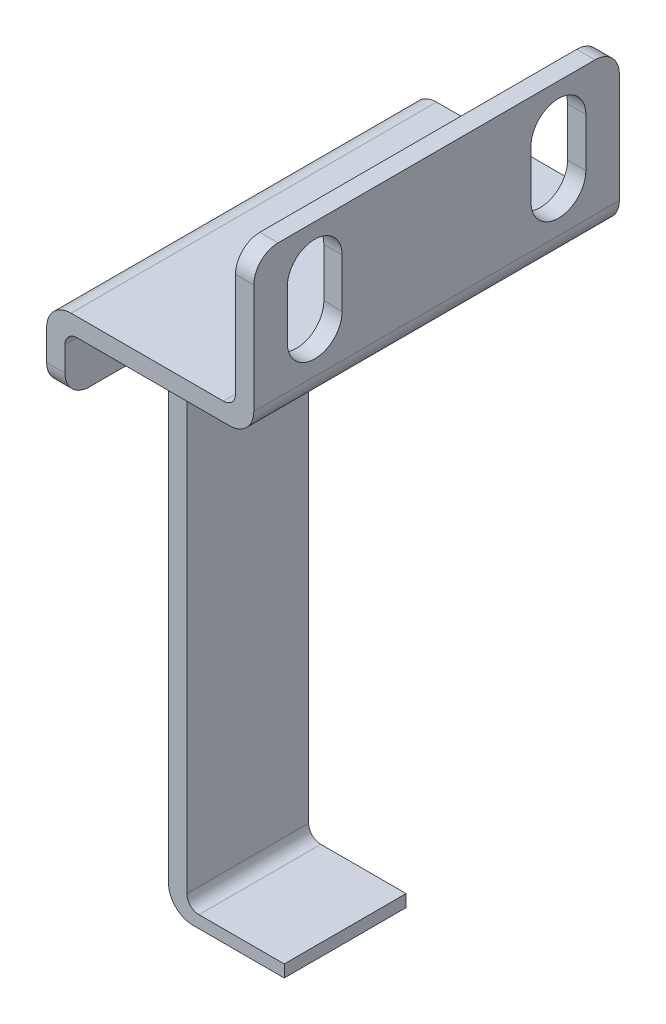
ISO-10303-21;
HEADER;
FILE_DESCRIPTION(('STEP AP214'),'2;1');
FILE_NAME('part.step','',(''),(''),'','','');
FILE_SCHEMA(('AUTOMOTIVE_DESIGN { 1 0 10303 214 1 1 1 1 }'));
ENDSEC;
DATA;
#1=APPLICATION_CONTEXT('core data for automotive mechanical design processes');
#2=APPLICATION_PROTOCOL_DEFINITION('international standard','automotive_design',2000,#1);
#3=PRODUCT_CONTEXT('',#1,'mechanical');
#4=PRODUCT('Part','Part','',(#3));
#5=PRODUCT_RELATED_PRODUCT_CATEGORY('part','',(#4));
#6=PRODUCT_DEFINITION_FORMATION('','',#4);
#7=PRODUCT_DEFINITION_CONTEXT('part definition',#1,'design');
#8=PRODUCT_DEFINITION('design','',#6,#7);
#9=PRODUCT_DEFINITION_SHAPE('','',#8);
#10=(LENGTH_UNIT() NAMED_UNIT(*) SI_UNIT(.MILLI.,.METRE.));
#11=(NAMED_UNIT(*) PLANE_ANGLE_UNIT() SI_UNIT($,.RADIAN.));
#12=(NAMED_UNIT(*) SI_UNIT($,.STERADIAN.) SOLID_ANGLE_UNIT());
#13=UNCERTAINTY_MEASURE_WITH_UNIT(LENGTH_MEASURE(1.E-05),#10,'distance_accuracy_value','');
#14=(GEOMETRIC_REPRESENTATION_CONTEXT(3) GLOBAL_UNCERTAINTY_ASSIGNED_CONTEXT((#13)) GLOBAL_UNIT_ASSIGNED_CONTEXT((#10,
#11,#12)) REPRESENTATION_CONTEXT('',''));
#15=CARTESIAN_POINT('',(0.,0.,0.));
#16=DIRECTION('',(0.,0.,1.));
#17=DIRECTION('',(1.,0.,0.));
#18=AXIS2_PLACEMENT_3D('',#15,#16,#17);
#19=CARTESIAN_POINT('',(-15.5,-37.,30.));
#20=DIRECTION('',(-1.,0.,0.));
#21=DIRECTION('',(0.,-1.,0.));
#22=AXIS2_PLACEMENT_3D('',#19,#20,#21);
#23=PLANE('',#22);
#24=DIRECTION('',(0.,1.,0.));
#25=VECTOR('',#24,1.);
#26=CARTESIAN_POINT('',(-15.5,-37.,0.));
#27=LINE('',#26,#25);
#28=CARTESIAN_POINT('',(-15.5,-3.,0.));
#29=VERTEX_POINT('',#28);
#30=CARTESIAN_POINT('',(-15.5,-1.,0.));
#31=VERTEX_POINT('',#30);
#32=EDGE_CURVE('E376',#29,#31,#27,.T.);
#33=ORIENTED_EDGE('',*,*,#32,.T.);
#34=DIRECTION('',(0.,0.,-1.));
#35=VECTOR('',#34,1.);
#36=CARTESIAN_POINT('',(-15.5,-1.,30.));
#37=LINE('',#36,#35);
#38=CARTESIAN_POINT('',(-15.5,-1.,30.));
#39=VERTEX_POINT('',#38);
#40=EDGE_CURVE('E432',#31,#39,#37,.F.);
#41=ORIENTED_EDGE('',*,*,#40,.T.);
#42=DIRECTION('',(0.,1.,0.));
#43=VECTOR('',#42,1.);
#44=CARTESIAN_POINT('',(-15.5,-37.,30.));
#45=LINE('',#44,#43);
#46=CARTESIAN_POINT('',(-15.5,-3.,30.));
#47=VERTEX_POINT('',#46);
#48=EDGE_CURVE('E374',#47,#39,#45,.T.);
#49=ORIENTED_EDGE('',*,*,#48,.F.);
#50=CARTESIAN_POINT('',(-15.5,-3.,28.));
#51=DIRECTION('',(-1.,0.,0.));
#52=DIRECTION('',(0.,-1.,0.));
#53=AXIS2_PLACEMENT_3D('',#50,#51,#52);
#54=CIRCLE('',#53,2.);
#55=CARTESIAN_POINT('',(-15.5,-5.,28.));
#56=VERTEX_POINT('',#55);
#57=EDGE_CURVE('E388',#47,#56,#54,.F.);
#58=ORIENTED_EDGE('',*,*,#57,.T.);
#59=DIRECTION('',(0.,0.,-1.));
#60=VECTOR('',#59,1.);
#61=CARTESIAN_POINT('',(-15.5,-5.,30.));
#62=LINE('',#61,#60);
#63=CARTESIAN_POINT('',(-15.5,-5.,20.));
#64=VERTEX_POINT('',#63);
#65=EDGE_CURVE('E238',#56,#64,#62,.T.);
#66=ORIENTED_EDGE('',*,*,#65,.T.);
#67=DIRECTION('',(0.,-1.,0.));
#68=VECTOR('',#67,1.);
#69=CARTESIAN_POINT('',(-15.5,-37.,20.));
#70=LINE('',#69,#68);
#71=CARTESIAN_POINT('',(-15.5,-45.,20.));
#72=VERTEX_POINT('',#71);
#73=EDGE_CURVE('E335',#64,#72,#70,.T.);
#74=ORIENTED_EDGE('',*,*,#73,.T.);
#75=DIRECTION('',(0.,0.,1.));
#76=VECTOR('',#75,1.);
#77=CARTESIAN_POINT('',(-15.5,-45.,10.));
#78=LINE('',#77,#76);
#79=CARTESIAN_POINT('',(-15.5,-45.,10.));
#80=VERTEX_POINT('',#79);
#81=EDGE_CURVE('E430',#72,#80,#78,.F.);
#82=ORIENTED_EDGE('',*,*,#81,.T.);
#83=DIRECTION('',(0.,1.,0.));
#84=VECTOR('',#83,1.);
#85=CARTESIAN_POINT('',(-15.5,-37.,10.));
#86=LINE('',#85,#84);
#87=CARTESIAN_POINT('',(-15.5,-5.,10.));
#88=VERTEX_POINT('',#87);
#89=EDGE_CURVE('E339',#80,#88,#86,.T.);
#90=ORIENTED_EDGE('',*,*,#89,.T.);
#91=DIRECTION('',(0.,0.,-1.));
#92=VECTOR('',#91,1.);
#93=CARTESIAN_POINT('',(-15.5,-5.,30.));
#94=LINE('',#93,#92);
#95=CARTESIAN_POINT('',(-15.5,-5.,2.));
#96=VERTEX_POINT('',#95);
#97=EDGE_CURVE('E367',#88,#96,#94,.T.);
#98=ORIENTED_EDGE('',*,*,#97,.T.);
#99=CARTESIAN_POINT('',(-15.5,-3.,2.));
#100=DIRECTION('',(-1.,0.,0.));
#101=DIRECTION('',(0.,-1.,0.));
#102=AXIS2_PLACEMENT_3D('',#99,#100,#101);
#103=CIRCLE('',#102,2.);
#104=EDGE_CURVE('E390',#96,#29,#103,.F.);
#105=ORIENTED_EDGE('',*,*,#104,.T.);
#106=EDGE_LOOP('',(#33,#41,#49,#58,#66,#74,#82,#90,#98,#105));
#107=FACE_BOUND('',#106,.T.);
#108=ADVANCED_FACE('F17',(#107),#23,.F.);
#109=CARTESIAN_POINT('',(0.,0.,30.));
#110=DIRECTION('',(-1.,0.,0.));
#111=DIRECTION('',(0.,0.,1.));
#112=AXIS2_PLACEMENT_3D('',#109,#110,#111);
#113=PLANE('',#112);
#114=DIRECTION('',(0.,1.,0.));
#115=VECTOR('',#114,1.);
#116=CARTESIAN_POINT('',(0.,9.5,27.25));
#117=LINE('',#116,#115);
#118=CARTESIAN_POINT('',(0.,5.5,27.25));
#119=VERTEX_POINT('',#118);
#120=CARTESIAN_POINT('',(0.,9.5,27.25));
#121=VERTEX_POINT('',#120);
#122=EDGE_CURVE('E274',#119,#121,#117,.T.);
#123=ORIENTED_EDGE('',*,*,#122,.T.);
#124=CARTESIAN_POINT('',(0.,9.5,25.));
#125=DIRECTION('',(-1.,0.,0.));
#126=DIRECTION('',(0.,0.,-1.));
#127=AXIS2_PLACEMENT_3D('',#124,#125,#126);
#128=CIRCLE('',#127,2.25);
#129=CARTESIAN_POINT('',(0.,9.5,22.75));
#130=VERTEX_POINT('',#129);
#131=EDGE_CURVE('E264',#121,#130,#128,.T.);
#132=ORIENTED_EDGE('',*,*,#131,.T.);
#133=DIRECTION('',(0.,-1.,0.));
#134=VECTOR('',#133,1.);
#135=CARTESIAN_POINT('',(0.,9.5,22.75));
#136=LINE('',#135,#134);
#137=CARTESIAN_POINT('',(0.,5.5,22.75));
#138=VERTEX_POINT('',#137);
#139=EDGE_CURVE('E267',#130,#138,#136,.T.);
#140=ORIENTED_EDGE('',*,*,#139,.T.);
#141=CARTESIAN_POINT('',(0.,5.5,25.));
#142=DIRECTION('',(-1.,0.,0.));
#143=DIRECTION('',(0.,0.,-1.));
#144=AXIS2_PLACEMENT_3D('',#141,#142,#143);
#145=CIRCLE('',#144,2.25);
#146=EDGE_CURVE('E271',#138,#119,#145,.T.);
#147=ORIENTED_EDGE('',*,*,#146,.T.);
#148=EDGE_LOOP('',(#123,#132,#140,#147));
#149=FACE_BOUND('',#148,.T.);
#150=DIRECTION('',(0.,1.,0.));
#151=VECTOR('',#150,1.);
#152=CARTESIAN_POINT('',(0.,9.5,7.25));
#153=LINE('',#152,#151);
#154=CARTESIAN_POINT('',(0.,5.5,7.25));
#155=VERTEX_POINT('',#154);
#156=CARTESIAN_POINT('',(0.,9.5,7.25));
#157=VERTEX_POINT('',#156);
#158=EDGE_CURVE('E306',#155,#157,#153,.T.);
#159=ORIENTED_EDGE('',*,*,#158,.T.);
#160=CARTESIAN_POINT('',(0.,9.5,5.));
#161=DIRECTION('',(-1.,0.,0.));
#162=DIRECTION('',(0.,0.,1.));
#163=AXIS2_PLACEMENT_3D('',#160,#161,#162);
#164=CIRCLE('',#163,2.25);
#165=CARTESIAN_POINT('',(0.,9.5,2.75));
#166=VERTEX_POINT('',#165);
#167=EDGE_CURVE('E296',#157,#166,#164,.T.);
#168=ORIENTED_EDGE('',*,*,#167,.T.);
#169=DIRECTION('',(0.,-1.,0.));
#170=VECTOR('',#169,1.);
#171=CARTESIAN_POINT('',(0.,9.5,2.75));
#172=LINE('',#171,#170);
#173=CARTESIAN_POINT('',(0.,5.5,2.75));
#174=VERTEX_POINT('',#173);
#175=EDGE_CURVE('E299',#166,#174,#172,.T.);
#176=ORIENTED_EDGE('',*,*,#175,.T.);
#177=CARTESIAN_POINT('',(0.,5.5,5.));
#178=DIRECTION('',(-1.,0.,0.));
#179=DIRECTION('',(0.,0.,1.));
#180=AXIS2_PLACEMENT_3D('',#177,#178,#179);
#181=CIRCLE('',#180,2.25);
#182=EDGE_CURVE('E303',#174,#155,#181,.T.);
#183=ORIENTED_EDGE('',*,*,#182,.T.);
#184=EDGE_LOOP('',(#159,#168,#176,#183));
#185=FACE_BOUND('',#184,.T.);
#186=DIRECTION('',(0.,1.,0.));
#187=VECTOR('',#186,1.);
#188=CARTESIAN_POINT('',(0.,0.,30.));
#189=LINE('',#188,#187);
#190=CARTESIAN_POINT('',(0.,2.,30.));
#191=VERTEX_POINT('',#190);
#192=CARTESIAN_POINT('',(0.,11.,30.));
#193=VERTEX_POINT('',#192);
#194=EDGE_CURVE('E404',#191,#193,#189,.T.);
#195=ORIENTED_EDGE('',*,*,#194,.F.);
#196=DIRECTION('',(0.,0.,-1.));
#197=VECTOR('',#196,1.);
#198=CARTESIAN_POINT('',(0.,2.,30.));
#199=LINE('',#198,#197);
#200=CARTESIAN_POINT('',(0.,2.,0.));
#201=VERTEX_POINT('',#200);
#202=EDGE_CURVE('E25',#191,#201,#199,.T.);
#203=ORIENTED_EDGE('',*,*,#202,.T.);
#204=DIRECTION('',(0.,1.,0.));
#205=VECTOR('',#204,1.);
#206=CARTESIAN_POINT('',(0.,0.,0.));
#207=LINE('',#206,#205);
#208=CARTESIAN_POINT('',(0.,11.,0.));
#209=VERTEX_POINT('',#208);
#210=EDGE_CURVE('E392',#201,#209,#207,.T.);
#211=ORIENTED_EDGE('',*,*,#210,.T.);
#212=CARTESIAN_POINT('',(0.,11.,2.));
#213=DIRECTION('',(-1.,0.,0.));
#214=DIRECTION('',(0.,0.,1.));
#215=AXIS2_PLACEMENT_3D('',#212,#213,#214);
#216=CIRCLE('',#215,2.);
#217=CARTESIAN_POINT('',(0.,13.,2.));
#218=VERTEX_POINT('',#217);
#219=EDGE_CURVE('E350',#209,#218,#216,.F.);
#220=ORIENTED_EDGE('',*,*,#219,.T.);
#221=DIRECTION('',(0.,0.,-1.));
#222=VECTOR('',#221,1.);
#223=CARTESIAN_POINT('',(0.,13.,30.));
#224=LINE('',#223,#222);
#225=CARTESIAN_POINT('',(0.,13.,28.));
#226=VERTEX_POINT('',#225);
#227=EDGE_CURVE('E331',#226,#218,#224,.T.);
#228=ORIENTED_EDGE('',*,*,#227,.F.);
#229=CARTESIAN_POINT('',(0.,11.,28.));
#230=DIRECTION('',(-1.,0.,0.));
#231=DIRECTION('',(0.,0.,1.));
#232=AXIS2_PLACEMENT_3D('',#229,#230,#231);
#233=CIRCLE('',#232,2.);
#234=EDGE_CURVE('E347',#226,#193,#233,.F.);
#235=ORIENTED_EDGE('',*,*,#234,.T.);
#236=EDGE_LOOP('',(#195,#203,#211,#220,#228,#235));
#237=FACE_BOUND('',#236,.T.);
#238=ADVANCED_FACE('F476',(#149,#185,#237),#113,.F.);
#239=CARTESIAN_POINT('',(-1.5,13.,30.));
#240=DIRECTION('',(0.,-1.,0.));
#241=DIRECTION('',(0.,0.,-1.));
#242=AXIS2_PLACEMENT_3D('',#239,#240,#241);
#243=PLANE('',#242);
#244=ORIENTED_EDGE('',*,*,#227,.T.);
#245=DIRECTION('',(-1.,0.,0.));
#246=VECTOR('',#245,1.);
#247=CARTESIAN_POINT('',(-1.5,13.,2.));
#248=LINE('',#247,#246);
#249=CARTESIAN_POINT('',(-1.5,13.,2.));
#250=VERTEX_POINT('',#249);
#251=EDGE_CURVE('E338',#218,#250,#248,.T.);
#252=ORIENTED_EDGE('',*,*,#251,.T.);
#253=DIRECTION('',(0.,0.,-1.));
#254=VECTOR('',#253,1.);
#255=CARTESIAN_POINT('',(-1.5,13.,30.));
#256=LINE('',#255,#254);
#257=CARTESIAN_POINT('',(-1.5,13.,28.));
#258=VERTEX_POINT('',#257);
#259=EDGE_CURVE('E328',#258,#250,#256,.T.);
#260=ORIENTED_EDGE('',*,*,#259,.F.);
#261=DIRECTION('',(-1.,0.,0.));
#262=VECTOR('',#261,1.);
#263=CARTESIAN_POINT('',(-1.5,13.,28.));
#264=LINE('',#263,#262);
#265=EDGE_CURVE('E336',#258,#226,#264,.F.);
#266=ORIENTED_EDGE('',*,*,#265,.T.);
#267=EDGE_LOOP('',(#244,#252,#260,#266));
#268=FACE_BOUND('',#267,.T.);
#269=ADVANCED_FACE('F491',(#268),#243,.F.);
#270=CARTESIAN_POINT('',(-1.5,1.5,30.));
#271=DIRECTION('',(1.,0.,0.));
#272=DIRECTION('',(0.,0.,-1.));
#273=AXIS2_PLACEMENT_3D('',#270,#271,#272);
#274=PLANE('',#273);
#275=DIRECTION('',(0.,-1.,0.));
#276=VECTOR('',#275,1.);
#277=CARTESIAN_POINT('',(-1.5,9.5,22.75));
#278=LINE('',#277,#276);
#279=CARTESIAN_POINT('',(-1.5,9.5,22.75));
#280=VERTEX_POINT('',#279);
#281=CARTESIAN_POINT('',(-1.5,5.5,22.75));
#282=VERTEX_POINT('',#281);
#283=EDGE_CURVE('E279',#280,#282,#278,.T.);
#284=ORIENTED_EDGE('',*,*,#283,.F.);
#285=CARTESIAN_POINT('',(-1.5,9.5,25.));
#286=DIRECTION('',(-1.,0.,0.));
#287=DIRECTION('',(0.,0.,-1.));
#288=AXIS2_PLACEMENT_3D('',#285,#286,#287);
#289=CIRCLE('',#288,2.25);
#290=CARTESIAN_POINT('',(-1.5,9.5,27.25));
#291=VERTEX_POINT('',#290);
#292=EDGE_CURVE('E263',#291,#280,#289,.T.);
#293=ORIENTED_EDGE('',*,*,#292,.F.);
#294=DIRECTION('',(0.,1.,0.));
#295=VECTOR('',#294,1.);
#296=CARTESIAN_POINT('',(-1.5,9.5,27.25));
#297=LINE('',#296,#295);
#298=CARTESIAN_POINT('',(-1.5,5.5,27.25));
#299=VERTEX_POINT('',#298);
#300=EDGE_CURVE('E268',#299,#291,#297,.T.);
#301=ORIENTED_EDGE('',*,*,#300,.F.);
#302=CARTESIAN_POINT('',(-1.5,5.5,25.));
#303=DIRECTION('',(-1.,0.,0.));
#304=DIRECTION('',(0.,0.,-1.));
#305=AXIS2_PLACEMENT_3D('',#302,#303,#304);
#306=CIRCLE('',#305,2.25);
#307=EDGE_CURVE('E282',#282,#299,#306,.T.);
#308=ORIENTED_EDGE('',*,*,#307,.F.);
#309=EDGE_LOOP('',(#284,#293,#301,#308));
#310=FACE_BOUND('',#309,.T.);
#311=DIRECTION('',(0.,-1.,0.));
#312=VECTOR('',#311,1.);
#313=CARTESIAN_POINT('',(-1.5,9.5,2.75));
#314=LINE('',#313,#312);
#315=CARTESIAN_POINT('',(-1.5,9.5,2.75));
#316=VERTEX_POINT('',#315);
#317=CARTESIAN_POINT('',(-1.5,5.5,2.75));
#318=VERTEX_POINT('',#317);
#319=EDGE_CURVE('E311',#316,#318,#314,.T.);
#320=ORIENTED_EDGE('',*,*,#319,.F.);
#321=CARTESIAN_POINT('',(-1.5,9.5,5.));
#322=DIRECTION('',(-1.,0.,0.));
#323=DIRECTION('',(0.,0.,1.));
#324=AXIS2_PLACEMENT_3D('',#321,#322,#323);
#325=CIRCLE('',#324,2.25);
#326=CARTESIAN_POINT('',(-1.5,9.5,7.25));
#327=VERTEX_POINT('',#326);
#328=EDGE_CURVE('E289',#327,#316,#325,.T.);
#329=ORIENTED_EDGE('',*,*,#328,.F.);
#330=DIRECTION('',(0.,1.,0.));
#331=VECTOR('',#330,1.);
#332=CARTESIAN_POINT('',(-1.5,9.5,7.25));
#333=LINE('',#332,#331);
#334=CARTESIAN_POINT('',(-1.5,5.5,7.25));
#335=VERTEX_POINT('',#334);
#336=EDGE_CURVE('E300',#335,#327,#333,.T.);
#337=ORIENTED_EDGE('',*,*,#336,.F.);
#338=CARTESIAN_POINT('',(-1.5,5.5,5.));
#339=DIRECTION('',(-1.,0.,0.));
#340=DIRECTION('',(0.,0.,1.));
#341=AXIS2_PLACEMENT_3D('',#338,#339,#340);
#342=CIRCLE('',#341,2.25);
#343=EDGE_CURVE('E314',#318,#335,#342,.T.);
#344=ORIENTED_EDGE('',*,*,#343,.F.);
#345=EDGE_LOOP('',(#320,#329,#337,#344));
#346=FACE_BOUND('',#345,.T.);
#347=DIRECTION('',(0.,-1.,0.));
#348=VECTOR('',#347,1.);
#349=CARTESIAN_POINT('',(-1.5,0.,0.));
#350=LINE('',#349,#348);
#351=CARTESIAN_POINT('',(-1.5,11.,0.));
#352=VERTEX_POINT('',#351);
#353=CARTESIAN_POINT('',(-1.5,2.5,0.));
#354=VERTEX_POINT('',#353);
#355=EDGE_CURVE('E358',#352,#354,#350,.T.);
#356=ORIENTED_EDGE('',*,*,#355,.T.);
#357=DIRECTION('',(0.,0.,-1.));
#358=VECTOR('',#357,1.);
#359=CARTESIAN_POINT('',(-1.5,2.5,30.));
#360=LINE('',#359,#358);
#361=CARTESIAN_POINT('',(-1.5,2.5,30.));
#362=VERTEX_POINT('',#361);
#363=EDGE_CURVE('E437',#354,#362,#360,.F.);
#364=ORIENTED_EDGE('',*,*,#363,.T.);
#365=DIRECTION('',(0.,-1.,0.));
#366=VECTOR('',#365,1.);
#367=CARTESIAN_POINT('',(-1.5,0.,30.));
#368=LINE('',#367,#366);
#369=CARTESIAN_POINT('',(-1.5,11.,30.));
#370=VERTEX_POINT('',#369);
#371=EDGE_CURVE('E363',#370,#362,#368,.T.);
#372=ORIENTED_EDGE('',*,*,#371,.F.);
#373=CARTESIAN_POINT('',(-1.5,11.,28.));
#374=DIRECTION('',(1.,0.,0.));
#375=DIRECTION('',(0.,0.,-1.));
#376=AXIS2_PLACEMENT_3D('',#373,#374,#375);
#377=CIRCLE('',#376,2.);
#378=EDGE_CURVE('E342',#370,#258,#377,.F.);
#379=ORIENTED_EDGE('',*,*,#378,.T.);
#380=ORIENTED_EDGE('',*,*,#259,.T.);
#381=CARTESIAN_POINT('',(-1.5,11.,2.));
#382=DIRECTION('',(1.,0.,0.));
#383=DIRECTION('',(0.,0.,-1.));
#384=AXIS2_PLACEMENT_3D('',#381,#382,#383);
#385=CIRCLE('',#384,2.);
#386=EDGE_CURVE('E344',#250,#352,#385,.F.);
#387=ORIENTED_EDGE('',*,*,#386,.T.);
#388=EDGE_LOOP('',(#356,#364,#372,#379,#380,#387));
#389=FACE_BOUND('',#388,.T.);
#390=ADVANCED_FACE('F501',(#310,#346,#389),#274,.F.);
#391=CARTESIAN_POINT('',(-7.,1.5,30.));
#392=DIRECTION('',(0.,-1.,0.));
#393=DIRECTION('',(1.,0.,0.));
#394=AXIS2_PLACEMENT_3D('',#391,#392,#393);
#395=PLANE('',#394);
#396=DIRECTION('',(-1.,0.,0.));
#397=VECTOR('',#396,1.);
#398=CARTESIAN_POINT('',(-7.,1.5,0.));
#399=LINE('',#398,#397);
#400=CARTESIAN_POINT('',(-2.5,1.5,0.));
#401=VERTEX_POINT('',#400);
#402=CARTESIAN_POINT('',(-15.,1.5,0.));
#403=VERTEX_POINT('',#402);
#404=EDGE_CURVE('E354',#401,#403,#399,.T.);
#405=ORIENTED_EDGE('',*,*,#404,.T.);
#406=DIRECTION('',(0.,0.,-1.));
#407=VECTOR('',#406,1.);
#408=CARTESIAN_POINT('',(-15.,1.5,30.));
#409=LINE('',#408,#407);
#410=CARTESIAN_POINT('',(-15.,1.5,30.));
#411=VERTEX_POINT('',#410);
#412=EDGE_CURVE('E468',#403,#411,#409,.F.);
#413=ORIENTED_EDGE('',*,*,#412,.T.);
#414=DIRECTION('',(-1.,0.,0.));
#415=VECTOR('',#414,1.);
#416=CARTESIAN_POINT('',(-7.,1.5,30.));
#417=LINE('',#416,#415);
#418=CARTESIAN_POINT('',(-2.5,1.5,30.));
#419=VERTEX_POINT('',#418);
#420=EDGE_CURVE('E359',#419,#411,#417,.T.);
#421=ORIENTED_EDGE('',*,*,#420,.F.);
#422=DIRECTION('',(0.,0.,-1.));
#423=VECTOR('',#422,1.);
#424=CARTESIAN_POINT('',(-2.5,1.5,0.));
#425=LINE('',#424,#423);
#426=EDGE_CURVE('E434',#419,#401,#425,.T.);
#427=ORIENTED_EDGE('',*,*,#426,.T.);
#428=EDGE_LOOP('',(#405,#413,#421,#427));
#429=FACE_BOUND('',#428,.T.);
#430=ADVANCED_FACE('F509',(#429),#395,.F.);
#431=CARTESIAN_POINT('',(-17.,-35.5,30.));
#432=DIRECTION('',(1.,0.,0.));
#433=DIRECTION('',(0.,1.,0.));
#434=AXIS2_PLACEMENT_3D('',#431,#432,#433);
#435=PLANE('',#434);
#436=DIRECTION('',(0.,1.,0.));
#437=VECTOR('',#436,1.);
#438=CARTESIAN_POINT('',(-17.,-42.,10.));
#439=LINE('',#438,#437);
#440=CARTESIAN_POINT('',(-17.,-45.,10.));
#441=VERTEX_POINT('',#440);
#442=CARTESIAN_POINT('',(-17.,-5.,10.));
#443=VERTEX_POINT('',#442);
#444=EDGE_CURVE('E381',#441,#443,#439,.T.);
#445=ORIENTED_EDGE('',*,*,#444,.F.);
#446=DIRECTION('',(0.,0.,-1.));
#447=VECTOR('',#446,1.);
#448=CARTESIAN_POINT('',(-17.,-45.,30.));
#449=LINE('',#448,#447);
#450=CARTESIAN_POINT('',(-17.,-45.,20.));
#451=VERTEX_POINT('',#450);
#452=EDGE_CURVE('E461',#441,#451,#449,.F.);
#453=ORIENTED_EDGE('',*,*,#452,.T.);
#454=DIRECTION('',(0.,-1.,0.));
#455=VECTOR('',#454,1.);
#456=CARTESIAN_POINT('',(-17.,-42.,20.));
#457=LINE('',#456,#455);
#458=CARTESIAN_POINT('',(-17.,-5.,20.));
#459=VERTEX_POINT('',#458);
#460=EDGE_CURVE('E366',#459,#451,#457,.T.);
#461=ORIENTED_EDGE('',*,*,#460,.F.);
#462=DIRECTION('',(0.,0.,-1.));
#463=VECTOR('',#462,1.);
#464=CARTESIAN_POINT('',(-17.,-5.,20.));
#465=LINE('',#464,#463);
#466=CARTESIAN_POINT('',(-17.,-5.,28.));
#467=VERTEX_POINT('',#466);
#468=EDGE_CURVE('E364',#467,#459,#465,.T.);
#469=ORIENTED_EDGE('',*,*,#468,.F.);
#470=CARTESIAN_POINT('',(-17.,-3.,28.));
#471=DIRECTION('',(1.,0.,0.));
#472=DIRECTION('',(0.,1.,0.));
#473=AXIS2_PLACEMENT_3D('',#470,#471,#472);
#474=CIRCLE('',#473,2.);
#475=CARTESIAN_POINT('',(-17.,-3.,30.));
#476=VERTEX_POINT('',#475);
#477=EDGE_CURVE('E368',#467,#476,#474,.F.);
#478=ORIENTED_EDGE('',*,*,#477,.T.);
#479=DIRECTION('',(0.,-1.,0.));
#480=VECTOR('',#479,1.);
#481=CARTESIAN_POINT('',(-17.,-35.5,30.));
#482=LINE('',#481,#480);
#483=CARTESIAN_POINT('',(-17.,-0.5,30.));
#484=VERTEX_POINT('',#483);
#485=EDGE_CURVE('E362',#484,#476,#482,.T.);
#486=ORIENTED_EDGE('',*,*,#485,.F.);
#487=DIRECTION('',(0.,0.,-1.));
#488=VECTOR('',#487,1.);
#489=CARTESIAN_POINT('',(-17.,-0.5,30.));
#490=LINE('',#489,#488);
#491=CARTESIAN_POINT('',(-17.,-0.5,0.));
#492=VERTEX_POINT('',#491);
#493=EDGE_CURVE('E458',#484,#492,#490,.T.);
#494=ORIENTED_EDGE('',*,*,#493,.T.);
#495=DIRECTION('',(0.,-1.,0.));
#496=VECTOR('',#495,1.);
#497=CARTESIAN_POINT('',(-17.,-35.5,0.));
#498=LINE('',#497,#496);
#499=CARTESIAN_POINT('',(-17.,-3.,0.));
#500=VERTEX_POINT('',#499);
#501=EDGE_CURVE('E357',#492,#500,#498,.T.);
#502=ORIENTED_EDGE('',*,*,#501,.T.);
#503=CARTESIAN_POINT('',(-17.,-3.,2.));
#504=DIRECTION('',(1.,0.,0.));
#505=DIRECTION('',(0.,1.,0.));
#506=AXIS2_PLACEMENT_3D('',#503,#504,#505);
#507=CIRCLE('',#506,2.);
#508=CARTESIAN_POINT('',(-17.,-5.,2.));
#509=VERTEX_POINT('',#508);
#510=EDGE_CURVE('E372',#500,#509,#507,.F.);
#511=ORIENTED_EDGE('',*,*,#510,.T.);
#512=DIRECTION('',(0.,0.,-1.));
#513=VECTOR('',#512,1.);
#514=CARTESIAN_POINT('',(-17.,-5.,10.));
#515=LINE('',#514,#513);
#516=EDGE_CURVE('E321',#443,#509,#515,.T.);
#517=ORIENTED_EDGE('',*,*,#516,.F.);
#518=EDGE_LOOP('',(#445,#453,#461,#469,#478,#486,#494,#502,#511,#517));
#519=FACE_BOUND('',#518,.T.);
#520=ADVANCED_FACE('F518',(#519),#435,.F.);
#521=CARTESIAN_POINT('',(-17.,-47.,30.));
#522=DIRECTION('',(0.,1.,0.));
#523=DIRECTION('',(0.,0.,1.));
#524=AXIS2_PLACEMENT_3D('',#521,#522,#523);
#525=PLANE('',#524);
#526=DIRECTION('',(-1.,0.,0.));
#527=VECTOR('',#526,1.);
#528=CARTESIAN_POINT('',(-5.5,-47.,20.));
#529=LINE('',#528,#527);
#530=CARTESIAN_POINT('',(-7.5,-47.,20.));
#531=VERTEX_POINT('',#530);
#532=CARTESIAN_POINT('',(-15.,-47.,20.));
#533=VERTEX_POINT('',#532);
#534=EDGE_CURVE('E226',#531,#533,#529,.T.);
#535=ORIENTED_EDGE('',*,*,#534,.T.);
#536=DIRECTION('',(0.,0.,-1.));
#537=VECTOR('',#536,1.);
#538=CARTESIAN_POINT('',(-15.,-47.,30.));
#539=LINE('',#538,#537);
#540=CARTESIAN_POINT('',(-15.,-47.,10.));
#541=VERTEX_POINT('',#540);
#542=EDGE_CURVE('E454',#533,#541,#539,.T.);
#543=ORIENTED_EDGE('',*,*,#542,.T.);
#544=DIRECTION('',(-1.,0.,0.));
#545=VECTOR('',#544,1.);
#546=CARTESIAN_POINT('',(-5.5,-47.,10.));
#547=LINE('',#546,#545);
#548=CARTESIAN_POINT('',(-7.5,-47.,10.));
#549=VERTEX_POINT('',#548);
#550=EDGE_CURVE('E245',#549,#541,#547,.T.);
#551=ORIENTED_EDGE('',*,*,#550,.F.);
#552=DIRECTION('',(0.,0.,-1.));
#553=VECTOR('',#552,1.);
#554=CARTESIAN_POINT('',(-7.5,-47.,20.));
#555=LINE('',#554,#553);
#556=EDGE_CURVE('E242',#531,#549,#555,.T.);
#557=ORIENTED_EDGE('',*,*,#556,.F.);
#558=EDGE_LOOP('',(#535,#543,#551,#557));
#559=FACE_BOUND('',#558,.T.);
#560=ADVANCED_FACE('F243',(#559),#525,.F.);
#561=CARTESIAN_POINT('',(-5.5,0.,30.));
#562=DIRECTION('',(0.,1.,0.));
#563=DIRECTION('',(-1.,0.,0.));
#564=AXIS2_PLACEMENT_3D('',#561,#562,#563);
#565=PLANE('',#564);
#566=DIRECTION('',(1.,0.,0.));
#567=VECTOR('',#566,1.);
#568=CARTESIAN_POINT('',(-5.5,0.,0.));
#569=LINE('',#568,#567);
#570=CARTESIAN_POINT('',(-14.5,0.,0.));
#571=VERTEX_POINT('',#570);
#572=CARTESIAN_POINT('',(-2.,0.,0.));
#573=VERTEX_POINT('',#572);
#574=EDGE_CURVE('E402',#571,#573,#569,.T.);
#575=ORIENTED_EDGE('',*,*,#574,.T.);
#576=DIRECTION('',(0.,0.,-1.));
#577=VECTOR('',#576,1.);
#578=CARTESIAN_POINT('',(-2.,0.,30.));
#579=LINE('',#578,#577);
#580=CARTESIAN_POINT('',(-2.,0.,30.));
#581=VERTEX_POINT('',#580);
#582=EDGE_CURVE('E11',#573,#581,#579,.F.);
#583=ORIENTED_EDGE('',*,*,#582,.T.);
#584=DIRECTION('',(1.,0.,0.));
#585=VECTOR('',#584,1.);
#586=CARTESIAN_POINT('',(-5.5,0.,30.));
#587=LINE('',#586,#585);
#588=CARTESIAN_POINT('',(-14.5,0.,30.));
#589=VERTEX_POINT('',#588);
#590=EDGE_CURVE('E332',#589,#581,#587,.T.);
#591=ORIENTED_EDGE('',*,*,#590,.F.);
#592=DIRECTION('',(0.,0.,-1.));
#593=VECTOR('',#592,1.);
#594=CARTESIAN_POINT('',(-14.5,0.,0.));
#595=LINE('',#594,#593);
#596=EDGE_CURVE('E415',#589,#571,#595,.T.);
#597=ORIENTED_EDGE('',*,*,#596,.T.);
#598=EDGE_LOOP('',(#575,#583,#591,#597));
#599=FACE_BOUND('',#598,.T.);
#600=ADVANCED_FACE('F535',(#599),#565,.F.);
#601=CARTESIAN_POINT('',(-5.5,0.,30.));
#602=DIRECTION('',(0.,0.,-1.));
#603=DIRECTION('',(-1.,0.,0.));
#604=AXIS2_PLACEMENT_3D('',#601,#602,#603);
#605=PLANE('',#604);
#606=ORIENTED_EDGE('',*,*,#420,.T.);
#607=CARTESIAN_POINT('',(-15.,-0.5,30.));
#608=DIRECTION('',(0.,0.,-1.));
#609=DIRECTION('',(-1.,0.,0.));
#610=AXIS2_PLACEMENT_3D('',#607,#608,#609);
#611=CIRCLE('',#610,2.);
#612=EDGE_CURVE('E471',#411,#484,#611,.F.);
#613=ORIENTED_EDGE('',*,*,#612,.T.);
#614=ORIENTED_EDGE('',*,*,#485,.T.);
#615=DIRECTION('',(1.,0.,0.));
#616=VECTOR('',#615,1.);
#617=CARTESIAN_POINT('',(-5.5,-3.,30.));
#618=LINE('',#617,#616);
#619=EDGE_CURVE('E353',#476,#47,#618,.T.);
#620=ORIENTED_EDGE('',*,*,#619,.T.);
#621=ORIENTED_EDGE('',*,*,#48,.T.);
#622=CARTESIAN_POINT('',(-14.5,-1.,30.));
#623=DIRECTION('',(0.,0.,-1.));
#624=DIRECTION('',(-1.,0.,0.));
#625=AXIS2_PLACEMENT_3D('',#622,#623,#624);
#626=CIRCLE('',#625,1.);
#627=EDGE_CURVE('E444',#39,#589,#626,.T.);
#628=ORIENTED_EDGE('',*,*,#627,.T.);
#629=ORIENTED_EDGE('',*,*,#590,.T.);
#630=CARTESIAN_POINT('',(-2.,2.,30.));
#631=DIRECTION('',(0.,0.,-1.));
#632=DIRECTION('',(-1.,0.,0.));
#633=AXIS2_PLACEMENT_3D('',#630,#631,#632);
#634=CIRCLE('',#633,2.);
#635=EDGE_CURVE('E37',#581,#191,#634,.F.);
#636=ORIENTED_EDGE('',*,*,#635,.T.);
#637=ORIENTED_EDGE('',*,*,#194,.T.);
#638=DIRECTION('',(-1.,0.,0.));
#639=VECTOR('',#638,1.);
#640=CARTESIAN_POINT('',(-5.5,11.,30.));
#641=LINE('',#640,#639);
#642=EDGE_CURVE('E399',#193,#370,#641,.T.);
#643=ORIENTED_EDGE('',*,*,#642,.T.);
#644=ORIENTED_EDGE('',*,*,#371,.T.);
#645=CARTESIAN_POINT('',(-2.5,2.5,30.));
#646=DIRECTION('',(0.,0.,-1.));
#647=DIRECTION('',(-1.,0.,0.));
#648=AXIS2_PLACEMENT_3D('',#645,#646,#647);
#649=CIRCLE('',#648,1.);
#650=EDGE_CURVE('E448',#362,#419,#649,.T.);
#651=ORIENTED_EDGE('',*,*,#650,.T.);
#652=EDGE_LOOP('',(#606,#613,#614,#620,#621,#628,#629,#636,#637,#643,#644,#651));
#653=FACE_BOUND('',#652,.T.);
#654=ADVANCED_FACE('F498',(#653),#605,.F.);
#655=CARTESIAN_POINT('',(-5.5,0.,0.));
#656=DIRECTION('',(0.,0.,-1.));
#657=DIRECTION('',(-1.,0.,0.));
#658=AXIS2_PLACEMENT_3D('',#655,#656,#657);
#659=PLANE('',#658);
#660=ORIENTED_EDGE('',*,*,#501,.F.);
#661=CARTESIAN_POINT('',(-15.,-0.5,0.));
#662=DIRECTION('',(0.,0.,-1.));
#663=DIRECTION('',(-1.,0.,0.));
#664=AXIS2_PLACEMENT_3D('',#661,#662,#663);
#665=CIRCLE('',#664,2.);
#666=EDGE_CURVE('E466',#492,#403,#665,.T.);
#667=ORIENTED_EDGE('',*,*,#666,.T.);
#668=ORIENTED_EDGE('',*,*,#404,.F.);
#669=CARTESIAN_POINT('',(-2.5,2.5,0.));
#670=DIRECTION('',(0.,0.,-1.));
#671=DIRECTION('',(-1.,0.,0.));
#672=AXIS2_PLACEMENT_3D('',#669,#670,#671);
#673=CIRCLE('',#672,1.);
#674=EDGE_CURVE('E446',#401,#354,#673,.F.);
#675=ORIENTED_EDGE('',*,*,#674,.T.);
#676=ORIENTED_EDGE('',*,*,#355,.F.);
#677=DIRECTION('',(-1.,0.,0.));
#678=VECTOR('',#677,1.);
#679=CARTESIAN_POINT('',(-5.5,11.,0.));
#680=LINE('',#679,#678);
#681=EDGE_CURVE('E351',#352,#209,#680,.F.);
#682=ORIENTED_EDGE('',*,*,#681,.T.);
#683=ORIENTED_EDGE('',*,*,#210,.F.);
#684=CARTESIAN_POINT('',(-2.,2.,0.));
#685=DIRECTION('',(0.,0.,-1.));
#686=DIRECTION('',(-1.,0.,0.));
#687=AXIS2_PLACEMENT_3D('',#684,#685,#686);
#688=CIRCLE('',#687,2.);
#689=EDGE_CURVE('E464',#201,#573,#688,.T.);
#690=ORIENTED_EDGE('',*,*,#689,.T.);
#691=ORIENTED_EDGE('',*,*,#574,.F.);
#692=CARTESIAN_POINT('',(-14.5,-1.,0.));
#693=DIRECTION('',(0.,0.,-1.));
#694=DIRECTION('',(-1.,0.,0.));
#695=AXIS2_PLACEMENT_3D('',#692,#693,#694);
#696=CIRCLE('',#695,1.);
#697=EDGE_CURVE('E442',#571,#31,#696,.F.);
#698=ORIENTED_EDGE('',*,*,#697,.T.);
#699=ORIENTED_EDGE('',*,*,#32,.F.);
#700=DIRECTION('',(1.,0.,0.));
#701=VECTOR('',#700,1.);
#702=CARTESIAN_POINT('',(-17.,-3.,0.));
#703=LINE('',#702,#701);
#704=EDGE_CURVE('E346',#29,#500,#703,.F.);
#705=ORIENTED_EDGE('',*,*,#704,.T.);
#706=EDGE_LOOP('',(#660,#667,#668,#675,#676,#682,#683,#690,#691,#698,#699,#705));
#707=FACE_BOUND('',#706,.T.);
#708=ADVANCED_FACE('F480',(#707),#659,.T.);
#709=CARTESIAN_POINT('',(-5.5,-42.,20.));
#710=DIRECTION('',(0.,0.,-1.));
#711=DIRECTION('',(-1.,0.,0.));
#712=AXIS2_PLACEMENT_3D('',#709,#710,#711);
#713=PLANE('',#712);
#714=ORIENTED_EDGE('',*,*,#460,.T.);
#715=CARTESIAN_POINT('',(-15.,-45.,20.));
#716=DIRECTION('',(0.,0.,-1.));
#717=DIRECTION('',(-1.,0.,0.));
#718=AXIS2_PLACEMENT_3D('',#715,#716,#717);
#719=CIRCLE('',#718,2.);
#720=EDGE_CURVE('E234',#451,#533,#719,.F.);
#721=ORIENTED_EDGE('',*,*,#720,.T.);
#722=ORIENTED_EDGE('',*,*,#534,.F.);
#723=DIRECTION('',(0.,-1.,0.));
#724=VECTOR('',#723,1.);
#725=CARTESIAN_POINT('',(-7.5,-47.,20.));
#726=LINE('',#725,#724);
#727=CARTESIAN_POINT('',(-7.5,-46.,20.));
#728=VERTEX_POINT('',#727);
#729=EDGE_CURVE('E232',#728,#531,#726,.T.);
#730=ORIENTED_EDGE('',*,*,#729,.F.);
#731=DIRECTION('',(-1.,0.,0.));
#732=VECTOR('',#731,1.);
#733=CARTESIAN_POINT('',(-7.5,-46.,20.));
#734=LINE('',#733,#732);
#735=CARTESIAN_POINT('',(-14.5,-46.,20.));
#736=VERTEX_POINT('',#735);
#737=EDGE_CURVE('E258',#728,#736,#734,.T.);
#738=ORIENTED_EDGE('',*,*,#737,.T.);
#739=CARTESIAN_POINT('',(-14.5,-45.,20.));
#740=DIRECTION('',(0.,0.,-1.));
#741=DIRECTION('',(-1.,0.,0.));
#742=AXIS2_PLACEMENT_3D('',#739,#740,#741);
#743=CIRCLE('',#742,1.);
#744=EDGE_CURVE('E450',#736,#72,#743,.T.);
#745=ORIENTED_EDGE('',*,*,#744,.T.);
#746=ORIENTED_EDGE('',*,*,#73,.F.);
#747=DIRECTION('',(-1.,0.,0.));
#748=VECTOR('',#747,1.);
#749=CARTESIAN_POINT('',(-5.5,-5.,20.));
#750=LINE('',#749,#748);
#751=EDGE_CURVE('E239',#64,#459,#750,.T.);
#752=ORIENTED_EDGE('',*,*,#751,.T.);
#753=EDGE_LOOP('',(#714,#721,#722,#730,#738,#745,#746,#752));
#754=FACE_BOUND('',#753,.T.);
#755=ADVANCED_FACE('F229',(#754),#713,.F.);
#756=CARTESIAN_POINT('',(-5.5,-5.,20.));
#757=DIRECTION('',(0.,1.,0.));
#758=DIRECTION('',(0.,0.,1.));
#759=AXIS2_PLACEMENT_3D('',#756,#757,#758);
#760=PLANE('',#759);
#761=ORIENTED_EDGE('',*,*,#65,.F.);
#762=DIRECTION('',(1.,0.,0.));
#763=VECTOR('',#762,1.);
#764=CARTESIAN_POINT('',(-5.5,-5.,28.));
#765=LINE('',#764,#763);
#766=EDGE_CURVE('E378',#56,#467,#765,.F.);
#767=ORIENTED_EDGE('',*,*,#766,.T.);
#768=ORIENTED_EDGE('',*,*,#468,.T.);
#769=ORIENTED_EDGE('',*,*,#751,.F.);
#770=EDGE_LOOP('',(#761,#767,#768,#769));
#771=FACE_BOUND('',#770,.T.);
#772=ADVANCED_FACE('F589',(#771),#760,.F.);
#773=CARTESIAN_POINT('',(-5.5,-42.,10.));
#774=DIRECTION('',(0.,0.,1.));
#775=DIRECTION('',(1.,0.,0.));
#776=AXIS2_PLACEMENT_3D('',#773,#774,#775);
#777=PLANE('',#776);
#778=ORIENTED_EDGE('',*,*,#550,.T.);
#779=CARTESIAN_POINT('',(-15.,-45.,10.));
#780=DIRECTION('',(0.,0.,1.));
#781=DIRECTION('',(1.,0.,0.));
#782=AXIS2_PLACEMENT_3D('',#779,#780,#781);
#783=CIRCLE('',#782,2.);
#784=EDGE_CURVE('E456',#541,#441,#783,.F.);
#785=ORIENTED_EDGE('',*,*,#784,.T.);
#786=ORIENTED_EDGE('',*,*,#444,.T.);
#787=DIRECTION('',(-1.,0.,0.));
#788=VECTOR('',#787,1.);
#789=CARTESIAN_POINT('',(-5.5,-5.,10.));
#790=LINE('',#789,#788);
#791=EDGE_CURVE('E384',#88,#443,#790,.T.);
#792=ORIENTED_EDGE('',*,*,#791,.F.);
#793=ORIENTED_EDGE('',*,*,#89,.F.);
#794=CARTESIAN_POINT('',(-14.5,-45.,10.));
#795=DIRECTION('',(0.,0.,1.));
#796=DIRECTION('',(1.,0.,0.));
#797=AXIS2_PLACEMENT_3D('',#794,#795,#796);
#798=CIRCLE('',#797,1.);
#799=CARTESIAN_POINT('',(-14.5,-46.,10.));
#800=VERTEX_POINT('',#799);
#801=EDGE_CURVE('E452',#80,#800,#798,.T.);
#802=ORIENTED_EDGE('',*,*,#801,.T.);
#803=DIRECTION('',(-1.,0.,0.));
#804=VECTOR('',#803,1.);
#805=CARTESIAN_POINT('',(-7.5,-46.,10.));
#806=LINE('',#805,#804);
#807=CARTESIAN_POINT('',(-7.5,-46.,10.));
#808=VERTEX_POINT('',#807);
#809=EDGE_CURVE('E260',#808,#800,#806,.T.);
#810=ORIENTED_EDGE('',*,*,#809,.F.);
#811=DIRECTION('',(0.,1.,0.));
#812=VECTOR('',#811,1.);
#813=CARTESIAN_POINT('',(-7.5,-47.,10.));
#814=LINE('',#813,#812);
#815=EDGE_CURVE('E248',#549,#808,#814,.T.);
#816=ORIENTED_EDGE('',*,*,#815,.F.);
#817=EDGE_LOOP('',(#778,#785,#786,#792,#793,#802,#810,#816));
#818=FACE_BOUND('',#817,.T.);
#819=ADVANCED_FACE('F548',(#818),#777,.F.);
#820=CARTESIAN_POINT('',(-5.5,-5.,10.));
#821=DIRECTION('',(0.,1.,0.));
#822=DIRECTION('',(0.,0.,1.));
#823=AXIS2_PLACEMENT_3D('',#820,#821,#822);
#824=PLANE('',#823);
#825=ORIENTED_EDGE('',*,*,#516,.T.);
#826=DIRECTION('',(1.,0.,0.));
#827=VECTOR('',#826,1.);
#828=CARTESIAN_POINT('',(-15.5,-5.,2.));
#829=LINE('',#828,#827);
#830=EDGE_CURVE('E371',#509,#96,#829,.T.);
#831=ORIENTED_EDGE('',*,*,#830,.T.);
#832=ORIENTED_EDGE('',*,*,#97,.F.);
#833=ORIENTED_EDGE('',*,*,#791,.T.);
#834=EDGE_LOOP('',(#825,#831,#832,#833));
#835=FACE_BOUND('',#834,.T.);
#836=ADVANCED_FACE('F543',(#835),#824,.F.);
#837=CARTESIAN_POINT('',(0.,9.5,5.));
#838=DIRECTION('',(-1.,0.,0.));
#839=DIRECTION('',(0.,0.,1.));
#840=AXIS2_PLACEMENT_3D('',#837,#838,#839);
#841=CYLINDRICAL_SURFACE('',#840,2.25);
#842=ORIENTED_EDGE('',*,*,#328,.T.);
#843=DIRECTION('',(-1.,0.,0.));
#844=VECTOR('',#843,1.);
#845=CARTESIAN_POINT('',(0.,9.5,2.75));
#846=LINE('',#845,#844);
#847=EDGE_CURVE('E309',#166,#316,#846,.T.);
#848=ORIENTED_EDGE('',*,*,#847,.F.);
#849=ORIENTED_EDGE('',*,*,#167,.F.);
#850=DIRECTION('',(-1.,0.,0.));
#851=VECTOR('',#850,1.);
#852=CARTESIAN_POINT('',(0.,9.5,7.25));
#853=LINE('',#852,#851);
#854=EDGE_CURVE('E319',#157,#327,#853,.T.);
#855=ORIENTED_EDGE('',*,*,#854,.T.);
#856=EDGE_LOOP('',(#842,#848,#849,#855));
#857=FACE_BOUND('',#856,.T.);
#858=ADVANCED_FACE('F597',(#857),#841,.F.);
#859=CARTESIAN_POINT('',(0.,9.5,7.25));
#860=DIRECTION('',(0.,0.,1.));
#861=DIRECTION('',(0.,-1.,0.));
#862=AXIS2_PLACEMENT_3D('',#859,#860,#861);
#863=PLANE('',#862);
#864=ORIENTED_EDGE('',*,*,#336,.T.);
#865=ORIENTED_EDGE('',*,*,#854,.F.);
#866=ORIENTED_EDGE('',*,*,#158,.F.);
#867=DIRECTION('',(-1.,0.,0.));
#868=VECTOR('',#867,1.);
#869=CARTESIAN_POINT('',(0.,5.5,7.25));
#870=LINE('',#869,#868);
#871=EDGE_CURVE('E322',#155,#335,#870,.T.);
#872=ORIENTED_EDGE('',*,*,#871,.T.);
#873=EDGE_LOOP('',(#864,#865,#866,#872));
#874=FACE_BOUND('',#873,.T.);
#875=ADVANCED_FACE('F629',(#874),#863,.F.);
#876=CARTESIAN_POINT('',(0.,5.5,5.));
#877=DIRECTION('',(-1.,0.,0.));
#878=DIRECTION('',(0.,0.,1.));
#879=AXIS2_PLACEMENT_3D('',#876,#877,#878);
#880=CYLINDRICAL_SURFACE('',#879,2.25);
#881=ORIENTED_EDGE('',*,*,#343,.T.);
#882=ORIENTED_EDGE('',*,*,#871,.F.);
#883=ORIENTED_EDGE('',*,*,#182,.F.);
#884=DIRECTION('',(-1.,0.,0.));
#885=VECTOR('',#884,1.);
#886=CARTESIAN_POINT('',(0.,5.5,2.75));
#887=LINE('',#886,#885);
#888=EDGE_CURVE('E324',#174,#318,#887,.T.);
#889=ORIENTED_EDGE('',*,*,#888,.T.);
#890=EDGE_LOOP('',(#881,#882,#883,#889));
#891=FACE_BOUND('',#890,.T.);
#892=ADVANCED_FACE('F632',(#891),#880,.F.);
#893=CARTESIAN_POINT('',(0.,9.5,2.75));
#894=DIRECTION('',(0.,0.,-1.));
#895=DIRECTION('',(0.,1.,0.));
#896=AXIS2_PLACEMENT_3D('',#893,#894,#895);
#897=PLANE('',#896);
#898=ORIENTED_EDGE('',*,*,#319,.T.);
#899=ORIENTED_EDGE('',*,*,#888,.F.);
#900=ORIENTED_EDGE('',*,*,#175,.F.);
#901=ORIENTED_EDGE('',*,*,#847,.T.);
#902=EDGE_LOOP('',(#898,#899,#900,#901));
#903=FACE_BOUND('',#902,.T.);
#904=ADVANCED_FACE('F627',(#903),#897,.F.);
#905=CARTESIAN_POINT('',(0.,9.5,25.));
#906=DIRECTION('',(-1.,0.,0.));
#907=DIRECTION('',(0.,0.,1.));
#908=AXIS2_PLACEMENT_3D('',#905,#906,#907);
#909=CYLINDRICAL_SURFACE('',#908,2.25);
#910=ORIENTED_EDGE('',*,*,#292,.T.);
#911=DIRECTION('',(-1.,0.,0.));
#912=VECTOR('',#911,1.);
#913=CARTESIAN_POINT('',(0.,9.5,22.75));
#914=LINE('',#913,#912);
#915=EDGE_CURVE('E277',#130,#280,#914,.T.);
#916=ORIENTED_EDGE('',*,*,#915,.F.);
#917=ORIENTED_EDGE('',*,*,#131,.F.);
#918=DIRECTION('',(-1.,0.,0.));
#919=VECTOR('',#918,1.);
#920=CARTESIAN_POINT('',(0.,9.5,27.25));
#921=LINE('',#920,#919);
#922=EDGE_CURVE('E287',#121,#291,#921,.T.);
#923=ORIENTED_EDGE('',*,*,#922,.T.);
#924=EDGE_LOOP('',(#910,#916,#917,#923));
#925=FACE_BOUND('',#924,.T.);
#926=ADVANCED_FACE('F616',(#925),#909,.F.);
#927=CARTESIAN_POINT('',(0.,9.5,27.25));
#928=DIRECTION('',(0.,0.,1.));
#929=DIRECTION('',(0.,-1.,0.));
#930=AXIS2_PLACEMENT_3D('',#927,#928,#929);
#931=PLANE('',#930);
#932=ORIENTED_EDGE('',*,*,#300,.T.);
#933=ORIENTED_EDGE('',*,*,#922,.F.);
#934=ORIENTED_EDGE('',*,*,#122,.F.);
#935=DIRECTION('',(-1.,0.,0.));
#936=VECTOR('',#935,1.);
#937=CARTESIAN_POINT('',(0.,5.5,27.25));
#938=LINE('',#937,#936);
#939=EDGE_CURVE('E290',#119,#299,#938,.T.);
#940=ORIENTED_EDGE('',*,*,#939,.T.);
#941=EDGE_LOOP('',(#932,#933,#934,#940));
#942=FACE_BOUND('',#941,.T.);
#943=ADVANCED_FACE('F612',(#942),#931,.F.);
#944=CARTESIAN_POINT('',(0.,5.5,25.));
#945=DIRECTION('',(-1.,0.,0.));
#946=DIRECTION('',(0.,0.,1.));
#947=AXIS2_PLACEMENT_3D('',#944,#945,#946);
#948=CYLINDRICAL_SURFACE('',#947,2.25);
#949=ORIENTED_EDGE('',*,*,#307,.T.);
#950=ORIENTED_EDGE('',*,*,#939,.F.);
#951=ORIENTED_EDGE('',*,*,#146,.F.);
#952=DIRECTION('',(-1.,0.,0.));
#953=VECTOR('',#952,1.);
#954=CARTESIAN_POINT('',(0.,5.5,22.75));
#955=LINE('',#954,#953);
#956=EDGE_CURVE('E292',#138,#282,#955,.T.);
#957=ORIENTED_EDGE('',*,*,#956,.T.);
#958=EDGE_LOOP('',(#949,#950,#951,#957));
#959=FACE_BOUND('',#958,.T.);
#960=ADVANCED_FACE('F615',(#959),#948,.F.);
#961=CARTESIAN_POINT('',(0.,9.5,22.75));
#962=DIRECTION('',(0.,0.,-1.));
#963=DIRECTION('',(0.,1.,0.));
#964=AXIS2_PLACEMENT_3D('',#961,#962,#963);
#965=PLANE('',#964);
#966=ORIENTED_EDGE('',*,*,#283,.T.);
#967=ORIENTED_EDGE('',*,*,#956,.F.);
#968=ORIENTED_EDGE('',*,*,#139,.F.);
#969=ORIENTED_EDGE('',*,*,#915,.T.);
#970=EDGE_LOOP('',(#966,#967,#968,#969));
#971=FACE_BOUND('',#970,.T.);
#972=ADVANCED_FACE('F620',(#971),#965,.F.);
#973=CARTESIAN_POINT('',(-1.5,11.,2.));
#974=DIRECTION('',(1.,0.,0.));
#975=DIRECTION('',(0.,0.,-1.));
#976=AXIS2_PLACEMENT_3D('',#973,#974,#975);
#977=CYLINDRICAL_SURFACE('',#976,2.);
#978=ORIENTED_EDGE('',*,*,#219,.F.);
#979=ORIENTED_EDGE('',*,*,#681,.F.);
#980=ORIENTED_EDGE('',*,*,#386,.F.);
#981=ORIENTED_EDGE('',*,*,#251,.F.);
#982=EDGE_LOOP('',(#978,#979,#980,#981));
#983=FACE_BOUND('',#982,.T.);
#984=ADVANCED_FACE('F487',(#983),#977,.T.);
#985=CARTESIAN_POINT('',(0.,11.,28.));
#986=DIRECTION('',(-1.,0.,0.));
#987=DIRECTION('',(0.,0.,1.));
#988=AXIS2_PLACEMENT_3D('',#985,#986,#987);
#989=CYLINDRICAL_SURFACE('',#988,2.);
#990=ORIENTED_EDGE('',*,*,#234,.F.);
#991=ORIENTED_EDGE('',*,*,#265,.F.);
#992=ORIENTED_EDGE('',*,*,#378,.F.);
#993=ORIENTED_EDGE('',*,*,#642,.F.);
#994=EDGE_LOOP('',(#990,#991,#992,#993));
#995=FACE_BOUND('',#994,.T.);
#996=ADVANCED_FACE('F495',(#995),#989,.T.);
#997=CARTESIAN_POINT('',(-5.5,-3.,28.));
#998=DIRECTION('',(1.,0.,0.));
#999=DIRECTION('',(0.,0.,-1.));
#1000=AXIS2_PLACEMENT_3D('',#997,#998,#999);
#1001=CYLINDRICAL_SURFACE('',#1000,2.);
#1002=ORIENTED_EDGE('',*,*,#477,.F.);
#1003=ORIENTED_EDGE('',*,*,#766,.F.);
#1004=ORIENTED_EDGE('',*,*,#57,.F.);
#1005=ORIENTED_EDGE('',*,*,#619,.F.);
#1006=EDGE_LOOP('',(#1002,#1003,#1004,#1005));
#1007=FACE_BOUND('',#1006,.T.);
#1008=ADVANCED_FACE('F525',(#1007),#1001,.T.);
#1009=CARTESIAN_POINT('',(-5.5,-3.,2.));
#1010=DIRECTION('',(-1.,0.,0.));
#1011=DIRECTION('',(0.,0.,1.));
#1012=AXIS2_PLACEMENT_3D('',#1009,#1010,#1011);
#1013=CYLINDRICAL_SURFACE('',#1012,2.);
#1014=ORIENTED_EDGE('',*,*,#510,.F.);
#1015=ORIENTED_EDGE('',*,*,#704,.F.);
#1016=ORIENTED_EDGE('',*,*,#104,.F.);
#1017=ORIENTED_EDGE('',*,*,#830,.F.);
#1018=EDGE_LOOP('',(#1014,#1015,#1016,#1017));
#1019=FACE_BOUND('',#1018,.T.);
#1020=ADVANCED_FACE('F539',(#1019),#1013,.T.);
#1021=CARTESIAN_POINT('',(-7.5,-46.,20.));
#1022=DIRECTION('',(0.,-1.,0.));
#1023=DIRECTION('',(1.,0.,0.));
#1024=AXIS2_PLACEMENT_3D('',#1021,#1022,#1023);
#1025=PLANE('',#1024);
#1026=ORIENTED_EDGE('',*,*,#809,.T.);
#1027=DIRECTION('',(0.,0.,1.));
#1028=VECTOR('',#1027,1.);
#1029=CARTESIAN_POINT('',(-14.5,-46.,20.));
#1030=LINE('',#1029,#1028);
#1031=EDGE_CURVE('E439',#800,#736,#1030,.T.);
#1032=ORIENTED_EDGE('',*,*,#1031,.T.);
#1033=ORIENTED_EDGE('',*,*,#737,.F.);
#1034=DIRECTION('',(0.,0.,1.));
#1035=VECTOR('',#1034,1.);
#1036=CARTESIAN_POINT('',(-7.5,-46.,20.));
#1037=LINE('',#1036,#1035);
#1038=EDGE_CURVE('E252',#808,#728,#1037,.T.);
#1039=ORIENTED_EDGE('',*,*,#1038,.F.);
#1040=EDGE_LOOP('',(#1026,#1032,#1033,#1039));
#1041=FACE_BOUND('',#1040,.T.);
#1042=ADVANCED_FACE('F556',(#1041),#1025,.F.);
#1043=CARTESIAN_POINT('',(-7.5,0.,0.));
#1044=DIRECTION('',(-1.,0.,0.));
#1045=DIRECTION('',(0.,0.,1.));
#1046=AXIS2_PLACEMENT_3D('',#1043,#1044,#1045);
#1047=PLANE('',#1046);
#1048=ORIENTED_EDGE('',*,*,#729,.T.);
#1049=ORIENTED_EDGE('',*,*,#556,.T.);
#1050=ORIENTED_EDGE('',*,*,#815,.T.);
#1051=ORIENTED_EDGE('',*,*,#1038,.T.);
#1052=EDGE_LOOP('',(#1048,#1049,#1050,#1051));
#1053=FACE_BOUND('',#1052,.T.);
#1054=ADVANCED_FACE('F250',(#1053),#1047,.F.);
#1055=CARTESIAN_POINT('',(-14.5,-1.,30.));
#1056=DIRECTION('',(0.,0.,1.));
#1057=DIRECTION('',(1.,0.,0.));
#1058=AXIS2_PLACEMENT_3D('',#1055,#1056,#1057);
#1059=CYLINDRICAL_SURFACE('',#1058,1.);
#1060=ORIENTED_EDGE('',*,*,#627,.F.);
#1061=ORIENTED_EDGE('',*,*,#40,.F.);
#1062=ORIENTED_EDGE('',*,*,#697,.F.);
#1063=ORIENTED_EDGE('',*,*,#596,.F.);
#1064=EDGE_LOOP('',(#1060,#1061,#1062,#1063));
#1065=FACE_BOUND('',#1064,.T.);
#1066=ADVANCED_FACE('F533',(#1065),#1059,.F.);
#1067=CARTESIAN_POINT('',(-2.5,2.5,30.));
#1068=DIRECTION('',(0.,0.,1.));
#1069=DIRECTION('',(1.,0.,0.));
#1070=AXIS2_PLACEMENT_3D('',#1067,#1068,#1069);
#1071=CYLINDRICAL_SURFACE('',#1070,1.);
#1072=ORIENTED_EDGE('',*,*,#650,.F.);
#1073=ORIENTED_EDGE('',*,*,#363,.F.);
#1074=ORIENTED_EDGE('',*,*,#674,.F.);
#1075=ORIENTED_EDGE('',*,*,#426,.F.);
#1076=EDGE_LOOP('',(#1072,#1073,#1074,#1075));
#1077=FACE_BOUND('',#1076,.T.);
#1078=ADVANCED_FACE('F504',(#1077),#1071,.F.);
#1079=CARTESIAN_POINT('',(-14.5,-45.,20.));
#1080=DIRECTION('',(0.,0.,-1.));
#1081=DIRECTION('',(-1.,0.,0.));
#1082=AXIS2_PLACEMENT_3D('',#1079,#1080,#1081);
#1083=CYLINDRICAL_SURFACE('',#1082,1.);
#1084=ORIENTED_EDGE('',*,*,#801,.F.);
#1085=ORIENTED_EDGE('',*,*,#81,.F.);
#1086=ORIENTED_EDGE('',*,*,#744,.F.);
#1087=ORIENTED_EDGE('',*,*,#1031,.F.);
#1088=EDGE_LOOP('',(#1084,#1085,#1086,#1087));
#1089=FACE_BOUND('',#1088,.T.);
#1090=ADVANCED_FACE('F561',(#1089),#1083,.F.);
#1091=CARTESIAN_POINT('',(-15.,-45.,30.));
#1092=DIRECTION('',(0.,0.,-1.));
#1093=DIRECTION('',(-1.,0.,0.));
#1094=AXIS2_PLACEMENT_3D('',#1091,#1092,#1093);
#1095=CYLINDRICAL_SURFACE('',#1094,2.);
#1096=ORIENTED_EDGE('',*,*,#720,.F.);
#1097=ORIENTED_EDGE('',*,*,#452,.F.);
#1098=ORIENTED_EDGE('',*,*,#784,.F.);
#1099=ORIENTED_EDGE('',*,*,#542,.F.);
#1100=EDGE_LOOP('',(#1096,#1097,#1098,#1099));
#1101=FACE_BOUND('',#1100,.T.);
#1102=ADVANCED_FACE('F552',(#1101),#1095,.T.);
#1103=CARTESIAN_POINT('',(-15.,-0.5,30.));
#1104=DIRECTION('',(0.,0.,-1.));
#1105=DIRECTION('',(-1.,0.,0.));
#1106=AXIS2_PLACEMENT_3D('',#1103,#1104,#1105);
#1107=CYLINDRICAL_SURFACE('',#1106,2.);
#1108=ORIENTED_EDGE('',*,*,#612,.F.);
#1109=ORIENTED_EDGE('',*,*,#412,.F.);
#1110=ORIENTED_EDGE('',*,*,#666,.F.);
#1111=ORIENTED_EDGE('',*,*,#493,.F.);
#1112=EDGE_LOOP('',(#1108,#1109,#1110,#1111));
#1113=FACE_BOUND('',#1112,.T.);
#1114=ADVANCED_FACE('F513',(#1113),#1107,.T.);
#1115=CARTESIAN_POINT('',(-2.,2.,30.));
#1116=DIRECTION('',(0.,0.,-1.));
#1117=DIRECTION('',(-1.,0.,0.));
#1118=AXIS2_PLACEMENT_3D('',#1115,#1116,#1117);
#1119=CYLINDRICAL_SURFACE('',#1118,2.);
#1120=ORIENTED_EDGE('',*,*,#635,.F.);
#1121=ORIENTED_EDGE('',*,*,#582,.F.);
#1122=ORIENTED_EDGE('',*,*,#689,.F.);
#1123=ORIENTED_EDGE('',*,*,#202,.F.);
#1124=EDGE_LOOP('',(#1120,#1121,#1122,#1123));
#1125=FACE_BOUND('',#1124,.T.);
#1126=ADVANCED_FACE('F19',(#1125),#1119,.T.);
#1127=CLOSED_SHELL('',(#108,#238,#269,#390,#430,#520,#560,#600,#654,#708,#755,#772,#819,#836,
#858,#875,#892,#904,#926,#943,#960,#972,#984,#996,#1008,#1020,#1042,#1054,#1066,#1078,#1090,
#1102,#1114,#1126));
#1128=MANIFOLD_SOLID_BREP('B1',#1127);
#1129=ADVANCED_BREP_SHAPE_REPRESENTATION('',(#18,#1128),#14);
#1130=SHAPE_DEFINITION_REPRESENTATION(#9,#1129);
ENDSEC;
END-ISO-10303-21;
